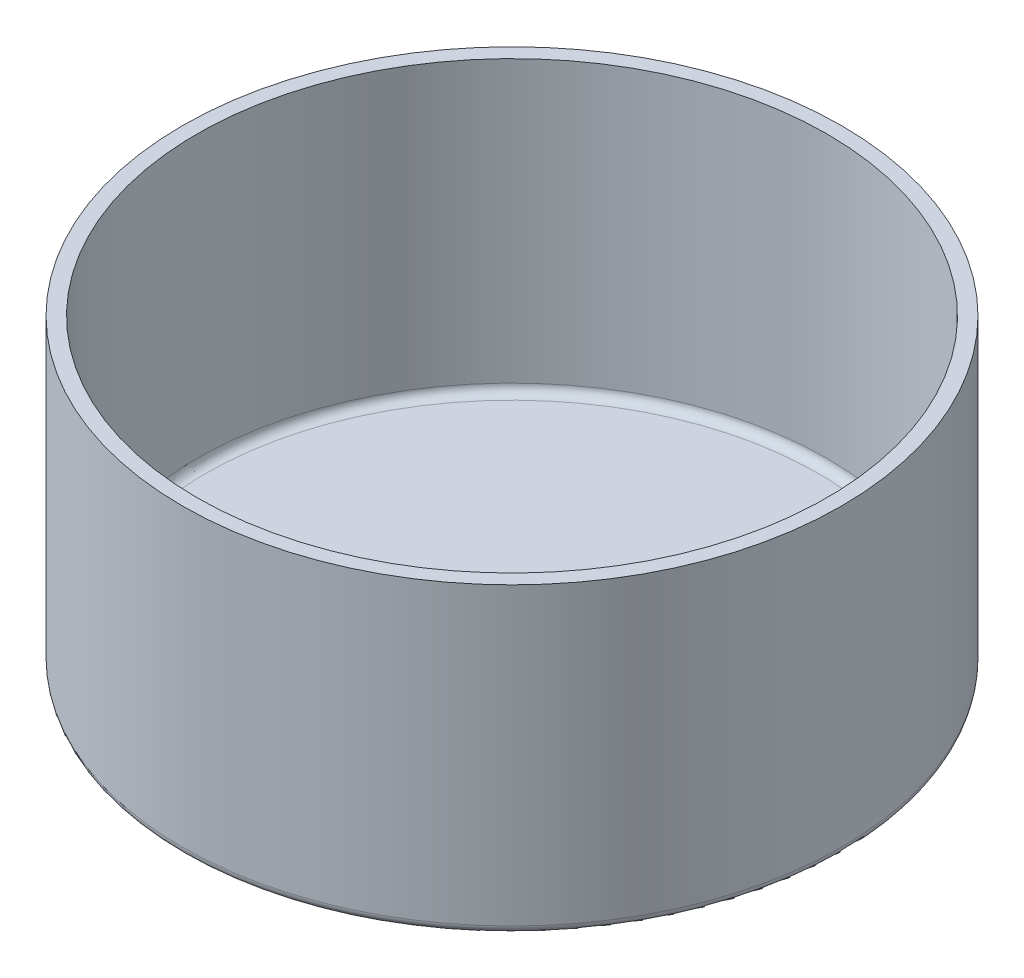
ISO-10303-21;
HEADER;
FILE_DESCRIPTION(('STEP AP214'),'2;1');
FILE_NAME('part.step','',(''),(''),'','','');
FILE_SCHEMA(('AUTOMOTIVE_DESIGN { 1 0 10303 214 1 1 1 1 }'));
ENDSEC;
DATA;
#1=APPLICATION_CONTEXT('core data for automotive mechanical design processes');
#2=APPLICATION_PROTOCOL_DEFINITION('international standard','automotive_design',2000,#1);
#3=PRODUCT_CONTEXT('',#1,'mechanical');
#4=PRODUCT('Part','Part','',(#3));
#5=PRODUCT_RELATED_PRODUCT_CATEGORY('part','',(#4));
#6=PRODUCT_DEFINITION_FORMATION('','',#4);
#7=PRODUCT_DEFINITION_CONTEXT('part definition',#1,'design');
#8=PRODUCT_DEFINITION('design','',#6,#7);
#9=PRODUCT_DEFINITION_SHAPE('','',#8);
#10=(LENGTH_UNIT() NAMED_UNIT(*) SI_UNIT(.MILLI.,.METRE.));
#11=(NAMED_UNIT(*) PLANE_ANGLE_UNIT() SI_UNIT($,.RADIAN.));
#12=(NAMED_UNIT(*) SI_UNIT($,.STERADIAN.) SOLID_ANGLE_UNIT());
#13=UNCERTAINTY_MEASURE_WITH_UNIT(LENGTH_MEASURE(1.E-05),#10,'distance_accuracy_value','');
#14=(GEOMETRIC_REPRESENTATION_CONTEXT(3) GLOBAL_UNCERTAINTY_ASSIGNED_CONTEXT((#13)) GLOBAL_UNIT_ASSIGNED_CONTEXT((#10,
#11,#12)) REPRESENTATION_CONTEXT('',''));
#15=CARTESIAN_POINT('',(0.,0.,0.));
#16=DIRECTION('',(0.,0.,1.));
#17=DIRECTION('',(1.,0.,0.));
#18=AXIS2_PLACEMENT_3D('',#15,#16,#17);
#19=CARTESIAN_POINT('',(0.,0.5,0.));
#20=DIRECTION('',(0.,-1.,0.));
#21=DIRECTION('',(0.,0.,-1.));
#22=AXIS2_PLACEMENT_3D('',#19,#20,#21);
#23=CYLINDRICAL_SURFACE('',#22,11.375);
#24=CARTESIAN_POINT('',(0.,0.3,0.));
#25=DIRECTION('',(0.,1.,0.));
#26=DIRECTION('',(0.,0.,1.));
#27=AXIS2_PLACEMENT_3D('',#24,#25,#26);
#28=CIRCLE('',#27,11.375);
#29=CARTESIAN_POINT('',(0.,0.3,11.375));
#30=VERTEX_POINT('',#29);
#31=EDGE_CURVE('E44',#30,#30,#28,.T.);
#32=ORIENTED_EDGE('',*,*,#31,.T.);
#33=EDGE_LOOP('',(#32));
#34=FACE_BOUND('',#33,.T.);
#35=CARTESIAN_POINT('',(0.,10.5,0.));
#36=DIRECTION('',(0.,1.,0.));
#37=DIRECTION('',(0.,0.,1.));
#38=AXIS2_PLACEMENT_3D('',#35,#36,#37);
#39=CIRCLE('',#38,11.375);
#40=CARTESIAN_POINT('',(0.,10.5,11.375));
#41=VERTEX_POINT('',#40);
#42=EDGE_CURVE('E60',#41,#41,#39,.T.);
#43=ORIENTED_EDGE('',*,*,#42,.F.);
#44=EDGE_LOOP('',(#43));
#45=FACE_BOUND('',#44,.T.);
#46=ADVANCED_FACE('F36',(#34,#45),#23,.T.);
#47=CARTESIAN_POINT('',(0.,0.,0.));
#48=DIRECTION('',(0.,1.,0.));
#49=DIRECTION('',(0.,0.,1.));
#50=AXIS2_PLACEMENT_3D('',#47,#48,#49);
#51=PLANE('',#50);
#52=CARTESIAN_POINT('',(0.,0.,0.));
#53=DIRECTION('',(0.,1.,0.));
#54=DIRECTION('',(0.,0.,1.));
#55=AXIS2_PLACEMENT_3D('',#52,#53,#54);
#56=CIRCLE('',#55,11.075);
#57=CARTESIAN_POINT('',(0.,0.,11.075));
#58=VERTEX_POINT('',#57);
#59=EDGE_CURVE('E10',#58,#58,#56,.F.);
#60=ORIENTED_EDGE('',*,*,#59,.T.);
#61=EDGE_LOOP('',(#60));
#62=FACE_BOUND('',#61,.T.);
#63=ADVANCED_FACE('F73',(#62),#51,.F.);
#64=CARTESIAN_POINT('',(0.,10.5,0.));
#65=DIRECTION('',(0.,1.,0.));
#66=DIRECTION('',(0.,0.,1.));
#67=AXIS2_PLACEMENT_3D('',#64,#65,#66);
#68=PLANE('',#67);
#69=ORIENTED_EDGE('',*,*,#42,.T.);
#70=EDGE_LOOP('',(#69));
#71=FACE_BOUND('',#70,.T.);
#72=CARTESIAN_POINT('',(0.,10.5,0.));
#73=DIRECTION('',(0.,1.,0.));
#74=DIRECTION('',(0.,0.,1.));
#75=AXIS2_PLACEMENT_3D('',#72,#73,#74);
#76=CIRCLE('',#75,10.875);
#77=CARTESIAN_POINT('',(0.,10.5,10.875));
#78=VERTEX_POINT('',#77);
#79=EDGE_CURVE('E64',#78,#78,#76,.T.);
#80=ORIENTED_EDGE('',*,*,#79,.F.);
#81=EDGE_LOOP('',(#80));
#82=FACE_BOUND('',#81,.T.);
#83=ADVANCED_FACE('F71',(#71,#82),#68,.T.);
#84=CARTESIAN_POINT('',(0.,10.5,0.));
#85=DIRECTION('',(0.,-1.,0.));
#86=DIRECTION('',(0.,0.,-1.));
#87=AXIS2_PLACEMENT_3D('',#84,#85,#86);
#88=CYLINDRICAL_SURFACE('',#87,10.875);
#89=CARTESIAN_POINT('',(0.,0.8,0.));
#90=DIRECTION('',(0.,1.,0.));
#91=DIRECTION('',(0.,0.,1.));
#92=AXIS2_PLACEMENT_3D('',#89,#90,#91);
#93=CIRCLE('',#92,10.875);
#94=CARTESIAN_POINT('',(0.,0.8,10.875));
#95=VERTEX_POINT('',#94);
#96=EDGE_CURVE('E54',#95,#95,#93,.F.);
#97=ORIENTED_EDGE('',*,*,#96,.T.);
#98=EDGE_LOOP('',(#97));
#99=FACE_BOUND('',#98,.T.);
#100=ORIENTED_EDGE('',*,*,#79,.T.);
#101=EDGE_LOOP('',(#100));
#102=FACE_BOUND('',#101,.T.);
#103=ADVANCED_FACE('F69',(#99,#102),#88,.F.);
#104=CARTESIAN_POINT('',(0.,0.5,0.));
#105=DIRECTION('',(0.,1.,0.));
#106=DIRECTION('',(0.,0.,1.));
#107=AXIS2_PLACEMENT_3D('',#104,#105,#106);
#108=PLANE('',#107);
#109=CARTESIAN_POINT('',(0.,0.5,0.));
#110=DIRECTION('',(0.,1.,0.));
#111=DIRECTION('',(0.,0.,1.));
#112=AXIS2_PLACEMENT_3D('',#109,#110,#111);
#113=CIRCLE('',#112,10.575);
#114=CARTESIAN_POINT('',(0.,0.5,10.575));
#115=VERTEX_POINT('',#114);
#116=EDGE_CURVE('E49',#115,#115,#113,.T.);
#117=ORIENTED_EDGE('',*,*,#116,.T.);
#118=EDGE_LOOP('',(#117));
#119=FACE_BOUND('',#118,.T.);
#120=ADVANCED_FACE('F80',(#119),#108,.T.);
#121=CARTESIAN_POINT('',(0.,0.8,0.));
#122=DIRECTION('',(0.,1.,0.));
#123=DIRECTION('',(0.,0.,1.));
#124=AXIS2_PLACEMENT_3D('',#121,#122,#123);
#125=TOROIDAL_SURFACE('',#124,10.575,0.3);
#126=ORIENTED_EDGE('',*,*,#116,.F.);
#127=EDGE_LOOP('',(#126));
#128=FACE_BOUND('',#127,.T.);
#129=ORIENTED_EDGE('',*,*,#96,.F.);
#130=EDGE_LOOP('',(#129));
#131=FACE_BOUND('',#130,.T.);
#132=ADVANCED_FACE('F92',(#128,#131),#125,.F.);
#133=CARTESIAN_POINT('',(0.,0.3,0.));
#134=DIRECTION('',(0.,1.,0.));
#135=DIRECTION('',(0.,0.,1.));
#136=AXIS2_PLACEMENT_3D('',#133,#134,#135);
#137=TOROIDAL_SURFACE('',#136,11.075,0.3);
#138=ORIENTED_EDGE('',*,*,#59,.F.);
#139=EDGE_LOOP('',(#138));
#140=FACE_BOUND('',#139,.T.);
#141=ORIENTED_EDGE('',*,*,#31,.F.);
#142=EDGE_LOOP('',(#141));
#143=FACE_BOUND('',#142,.T.);
#144=ADVANCED_FACE('F38',(#140,#143),#137,.T.);
#145=CLOSED_SHELL('',(#46,#63,#83,#103,#120,#132,#144));
#146=MANIFOLD_SOLID_BREP('B2',#145);
#147=ADVANCED_BREP_SHAPE_REPRESENTATION('',(#18,#146),#14);
#148=SHAPE_DEFINITION_REPRESENTATION(#9,#147);
ENDSEC;
END-ISO-10303-21;
